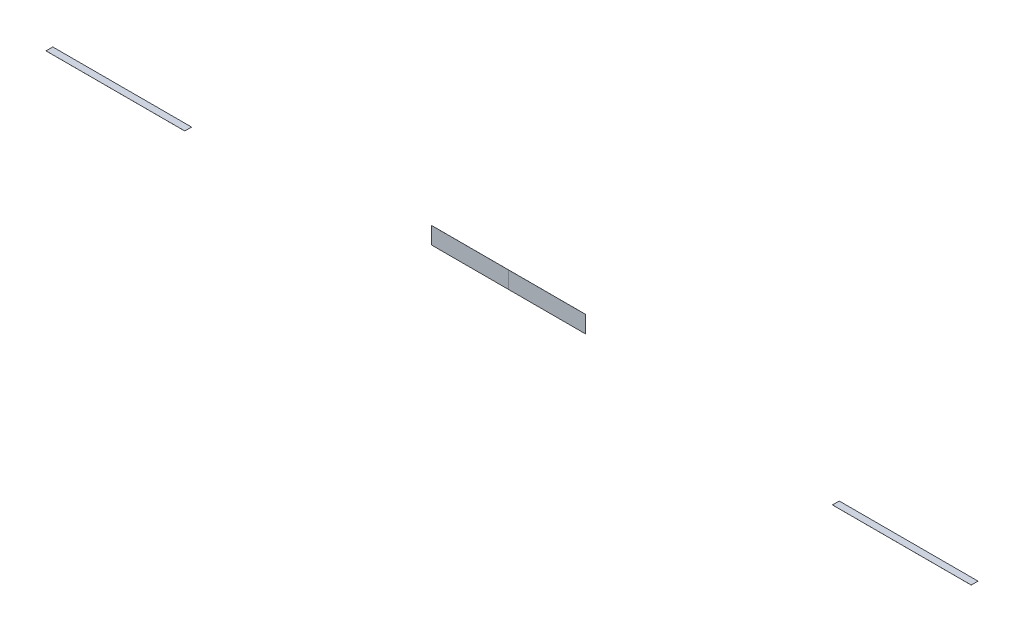
ISO-10303-21;
HEADER;
FILE_DESCRIPTION(('STEP AP214'),'2;1');
FILE_NAME('part.step','',(''),(''),'','','');
FILE_SCHEMA(('AUTOMOTIVE_DESIGN { 1 0 10303 214 1 1 1 1 }'));
ENDSEC;
DATA;
#1=APPLICATION_CONTEXT('core data for automotive mechanical design processes');
#2=APPLICATION_PROTOCOL_DEFINITION('international standard','automotive_design',2000,#1);
#3=PRODUCT_CONTEXT('',#1,'mechanical');
#4=PRODUCT('Part','Part','',(#3));
#5=PRODUCT_RELATED_PRODUCT_CATEGORY('part','',(#4));
#6=PRODUCT_DEFINITION_FORMATION('','',#4);
#7=PRODUCT_DEFINITION_CONTEXT('part definition',#1,'design');
#8=PRODUCT_DEFINITION('design','',#6,#7);
#9=PRODUCT_DEFINITION_SHAPE('','',#8);
#10=(LENGTH_UNIT() NAMED_UNIT(*) SI_UNIT(.MILLI.,.METRE.));
#11=(NAMED_UNIT(*) PLANE_ANGLE_UNIT() SI_UNIT($,.RADIAN.));
#12=(NAMED_UNIT(*) SI_UNIT($,.STERADIAN.) SOLID_ANGLE_UNIT());
#13=UNCERTAINTY_MEASURE_WITH_UNIT(LENGTH_MEASURE(1.E-05),#10,'distance_accuracy_value','');
#14=(GEOMETRIC_REPRESENTATION_CONTEXT(3) GLOBAL_UNCERTAINTY_ASSIGNED_CONTEXT((#13)) GLOBAL_UNIT_ASSIGNED_CONTEXT((#10,
#11,#12)) REPRESENTATION_CONTEXT('',''));
#15=CARTESIAN_POINT('',(0.,0.,0.));
#16=DIRECTION('',(0.,0.,1.));
#17=DIRECTION('',(1.,0.,0.));
#18=AXIS2_PLACEMENT_3D('',#15,#16,#17);
#19=CARTESIAN_POINT('',(2550.,91.99,-22.0100000000007));
#20=DIRECTION('',(-1.,0.,0.));
#21=DIRECTION('',(0.,0.,1.));
#22=AXIS2_PLACEMENT_3D('',#19,#20,#21);
#23=PLANE('',#22);
#24=DIRECTION('',(0.,0.,1.));
#25=VECTOR('',#24,1.);
#26=CARTESIAN_POINT('',(2550.,92.1,-11.0000000000007));
#27=LINE('',#26,#25);
#28=CARTESIAN_POINT('',(2550.,92.1,-22.0000000000007));
#29=VERTEX_POINT('',#28);
#30=CARTESIAN_POINT('',(2550.,92.1,-7.37216624891097E-13));
#31=VERTEX_POINT('',#30);
#32=EDGE_CURVE('P0_E77',#29,#31,#27,.T.);
#33=ORIENTED_EDGE('',*,*,#32,.F.);
#34=DIRECTION('',(0.,-1.,0.));
#35=VECTOR('',#34,1.);
#36=CARTESIAN_POINT('',(2550.,92.05,-22.0000000000007));
#37=LINE('',#36,#35);
#38=CARTESIAN_POINT('',(2550.,92.,-22.0000000000007));
#39=VERTEX_POINT('',#38);
#40=EDGE_CURVE('P0_E21',#29,#39,#37,.T.);
#41=ORIENTED_EDGE('',*,*,#40,.T.);
#42=DIRECTION('',(0.,0.,-1.));
#43=VECTOR('',#42,1.);
#44=CARTESIAN_POINT('',(2550.,92.,-11.0000000000007));
#45=LINE('',#44,#43);
#46=CARTESIAN_POINT('',(2550.,92.,-7.37216624891097E-13));
#47=VERTEX_POINT('',#46);
#48=EDGE_CURVE('P0_E58',#47,#39,#45,.T.);
#49=ORIENTED_EDGE('',*,*,#48,.F.);
#50=DIRECTION('',(0.,-1.,0.));
#51=VECTOR('',#50,1.);
#52=CARTESIAN_POINT('',(2550.,92.05,-7.37188088351104E-13));
#53=LINE('',#52,#51);
#54=EDGE_CURVE('P0_E61',#31,#47,#53,.T.);
#55=ORIENTED_EDGE('',*,*,#54,.F.);
#56=EDGE_LOOP('',(#33,#41,#49,#55));
#57=FACE_BOUND('',#56,.T.);
#58=ADVANCED_FACE('P0_F17',(#57),#23,.T.);
#59=CARTESIAN_POINT('',(2549.99,91.99,-7.37188088351104E-13));
#60=DIRECTION('',(0.,0.,1.));
#61=DIRECTION('',(1.,0.,0.));
#62=AXIS2_PLACEMENT_3D('',#59,#60,#61);
#63=PLANE('',#62);
#64=DIRECTION('',(1.,0.,0.));
#65=VECTOR('',#64,1.);
#66=CARTESIAN_POINT('',(2775.,92.1,-7.37194796852046E-13));
#67=LINE('',#66,#65);
#68=CARTESIAN_POINT('',(3000.,92.1,-7.37206477436389E-13));
#69=VERTEX_POINT('',#68);
#70=EDGE_CURVE('P0_E74',#31,#69,#67,.T.);
#71=ORIENTED_EDGE('',*,*,#70,.F.);
#72=ORIENTED_EDGE('',*,*,#54,.T.);
#73=DIRECTION('',(-1.,0.,0.));
#74=VECTOR('',#73,1.);
#75=CARTESIAN_POINT('',(2775.,92.,-7.37194796852046E-13));
#76=LINE('',#75,#74);
#77=CARTESIAN_POINT('',(3000.,92.,-7.37215354341676E-13));
#78=VERTEX_POINT('',#77);
#79=EDGE_CURVE('P0_E71',#78,#47,#76,.T.);
#80=ORIENTED_EDGE('',*,*,#79,.F.);
#81=DIRECTION('',(0.,-1.,0.));
#82=VECTOR('',#81,1.);
#83=CARTESIAN_POINT('',(3000.,92.05,-7.37189714654363E-13));
#84=LINE('',#83,#82);
#85=EDGE_CURVE('P0_E53',#69,#78,#84,.T.);
#86=ORIENTED_EDGE('',*,*,#85,.F.);
#87=EDGE_LOOP('',(#71,#72,#80,#86));
#88=FACE_BOUND('',#87,.T.);
#89=ADVANCED_FACE('P0_F70',(#88),#63,.T.);
#90=CARTESIAN_POINT('',(3000.,91.99,0.00999999999926281));
#91=DIRECTION('',(1.,0.,0.));
#92=DIRECTION('',(0.,0.,-1.));
#93=AXIS2_PLACEMENT_3D('',#90,#91,#92);
#94=PLANE('',#93);
#95=DIRECTION('',(0.,0.,-1.));
#96=VECTOR('',#95,1.);
#97=CARTESIAN_POINT('',(3000.,92.1,-11.0000000000007));
#98=LINE('',#97,#96);
#99=CARTESIAN_POINT('',(3000.,92.1,-22.0000000000007));
#100=VERTEX_POINT('',#99);
#101=EDGE_CURVE('P0_E85',#69,#100,#98,.T.);
#102=ORIENTED_EDGE('',*,*,#101,.F.);
#103=ORIENTED_EDGE('',*,*,#85,.T.);
#104=DIRECTION('',(0.,0.,1.));
#105=VECTOR('',#104,1.);
#106=CARTESIAN_POINT('',(3000.,92.,-11.0000000000007));
#107=LINE('',#106,#105);
#108=CARTESIAN_POINT('',(3000.,92.,-22.0000000000007));
#109=VERTEX_POINT('',#108);
#110=EDGE_CURVE('P0_E67',#109,#78,#107,.T.);
#111=ORIENTED_EDGE('',*,*,#110,.F.);
#112=DIRECTION('',(0.,1.,0.));
#113=VECTOR('',#112,1.);
#114=CARTESIAN_POINT('',(3000.,92.05,-22.0000000000007));
#115=LINE('',#114,#113);
#116=EDGE_CURVE('P0_E36',#109,#100,#115,.T.);
#117=ORIENTED_EDGE('',*,*,#116,.T.);
#118=EDGE_LOOP('',(#102,#103,#111,#117));
#119=FACE_BOUND('',#118,.T.);
#120=ADVANCED_FACE('P0_F89',(#119),#94,.T.);
#121=CARTESIAN_POINT('',(2549.99,92.,-22.0100000000007));
#122=DIRECTION('',(0.,-1.,0.));
#123=DIRECTION('',(1.,0.,0.));
#124=AXIS2_PLACEMENT_3D('',#121,#122,#123);
#125=PLANE('',#124);
#126=ORIENTED_EDGE('',*,*,#110,.T.);
#127=ORIENTED_EDGE('',*,*,#79,.T.);
#128=ORIENTED_EDGE('',*,*,#48,.T.);
#129=DIRECTION('',(-1.,0.,0.));
#130=VECTOR('',#129,1.);
#131=CARTESIAN_POINT('',(2775.,92.,-22.0000000000007));
#132=LINE('',#131,#130);
#133=EDGE_CURVE('P0_E27',#109,#39,#132,.T.);
#134=ORIENTED_EDGE('',*,*,#133,.F.);
#135=EDGE_LOOP('',(#126,#127,#128,#134));
#136=FACE_BOUND('',#135,.T.);
#137=ADVANCED_FACE('P0_F76',(#136),#125,.T.);
#138=CARTESIAN_POINT('',(2549.99,92.1,-22.0100000000007));
#139=DIRECTION('',(0.,1.,0.));
#140=DIRECTION('',(0.,0.,1.));
#141=AXIS2_PLACEMENT_3D('',#138,#139,#140);
#142=PLANE('',#141);
#143=ORIENTED_EDGE('',*,*,#101,.T.);
#144=DIRECTION('',(1.,0.,0.));
#145=VECTOR('',#144,1.);
#146=CARTESIAN_POINT('',(2775.,92.1,-22.0000000000007));
#147=LINE('',#146,#145);
#148=EDGE_CURVE('P0_E11',#29,#100,#147,.T.);
#149=ORIENTED_EDGE('',*,*,#148,.F.);
#150=ORIENTED_EDGE('',*,*,#32,.T.);
#151=ORIENTED_EDGE('',*,*,#70,.T.);
#152=EDGE_LOOP('',(#143,#149,#150,#151));
#153=FACE_BOUND('',#152,.T.);
#154=ADVANCED_FACE('P0_F97',(#153),#142,.T.);
#155=CARTESIAN_POINT('',(3000.01,91.99,-22.0000000000007));
#156=DIRECTION('',(0.,0.,-1.));
#157=DIRECTION('',(-1.,0.,0.));
#158=AXIS2_PLACEMENT_3D('',#155,#156,#157);
#159=PLANE('',#158);
#160=ORIENTED_EDGE('',*,*,#148,.T.);
#161=ORIENTED_EDGE('',*,*,#116,.F.);
#162=ORIENTED_EDGE('',*,*,#133,.T.);
#163=ORIENTED_EDGE('',*,*,#40,.F.);
#164=EDGE_LOOP('',(#160,#161,#162,#163));
#165=FACE_BOUND('',#164,.T.);
#166=ADVANCED_FACE('P0_F19',(#165),#159,.T.);
#167=CLOSED_SHELL('',(#58,#89,#120,#137,#154,#166));
#168=MANIFOLD_SOLID_BREP('P0_B1',#167);
#169=CARTESIAN_POINT('',(5.6843418860808E-13,91.99,-22.0100000000007));
#170=DIRECTION('',(-1.,0.,0.));
#171=DIRECTION('',(0.,0.,1.));
#172=AXIS2_PLACEMENT_3D('',#169,#170,#171);
#173=PLANE('',#172);
#174=DIRECTION('',(0.,0.,1.));
#175=VECTOR('',#174,1.);
#176=CARTESIAN_POINT('',(5.68437034638783E-13,92.1,-11.0000000000007));
#177=LINE('',#176,#175);
#178=CARTESIAN_POINT('',(5.70054503343871E-13,92.1,-22.0000000000007));
#179=VERTEX_POINT('',#178);
#180=CARTESIAN_POINT('',(5.65103807525407E-13,92.1,-7.369997844566E-13));
#181=VERTEX_POINT('',#180);
#182=EDGE_CURVE('P1_E77',#179,#181,#177,.T.);
#183=ORIENTED_EDGE('',*,*,#182,.F.);
#184=DIRECTION('',(0.,-1.,0.));
#185=VECTOR('',#184,1.);
#186=CARTESIAN_POINT('',(5.6843418860808E-13,92.05,-22.0000000000007));
#187=LINE('',#186,#185);
#188=CARTESIAN_POINT('',(5.81432586429236E-13,92.,-22.0000000000007));
#189=VERTEX_POINT('',#188);
#190=EDGE_CURVE('P1_E21',#179,#189,#187,.T.);
#191=ORIENTED_EDGE('',*,*,#190,.T.);
#192=DIRECTION('',(0.,0.,-1.));
#193=VECTOR('',#192,1.);
#194=CARTESIAN_POINT('',(5.86206938839231E-13,92.,-11.0000000000007));
#195=LINE('',#194,#193);
#196=CARTESIAN_POINT('',(5.65107094394061E-13,92.,-7.369997844566E-13));
#197=VERTEX_POINT('',#196);
#198=EDGE_CURVE('P1_E58',#197,#189,#195,.T.);
#199=ORIENTED_EDGE('',*,*,#198,.F.);
#200=DIRECTION('',(0.,-1.,0.));
#201=VECTOR('',#200,1.);
#202=CARTESIAN_POINT('',(5.68433646506994E-13,92.05,-7.37188088351104E-13));
#203=LINE('',#202,#201);
#204=EDGE_CURVE('P1_E61',#181,#197,#203,.T.);
#205=ORIENTED_EDGE('',*,*,#204,.F.);
#206=EDGE_LOOP('',(#183,#191,#199,#205));
#207=FACE_BOUND('',#206,.T.);
#208=ADVANCED_FACE('P1_F17',(#207),#173,.T.);
#209=CARTESIAN_POINT('',(-0.00999999999943157,91.99,-7.37188088351104E-13));
#210=DIRECTION('',(0.,0.,1.));
#211=DIRECTION('',(1.,0.,0.));
#212=AXIS2_PLACEMENT_3D('',#209,#210,#211);
#213=PLANE('',#212);
#214=DIRECTION('',(1.,0.,0.));
#215=VECTOR('',#214,1.);
#216=CARTESIAN_POINT('',(225.000000000001,92.1,-7.37194796852046E-13));
#217=LINE('',#216,#215);
#218=CARTESIAN_POINT('',(450.000000000001,92.1,-7.37206477436389E-13));
#219=VERTEX_POINT('',#218);
#220=EDGE_CURVE('P1_E74',#181,#219,#217,.T.);
#221=ORIENTED_EDGE('',*,*,#220,.F.);
#222=ORIENTED_EDGE('',*,*,#204,.T.);
#223=DIRECTION('',(-1.,0.,0.));
#224=VECTOR('',#223,1.);
#225=CARTESIAN_POINT('',(225.000000000001,92.,-7.37194796852046E-13));
#226=LINE('',#225,#224);
#227=CARTESIAN_POINT('',(450.000000000001,92.,-7.36998513907179E-13));
#228=VERTEX_POINT('',#227);
#229=EDGE_CURVE('P1_E71',#228,#197,#226,.T.);
#230=ORIENTED_EDGE('',*,*,#229,.F.);
#231=DIRECTION('',(0.,-1.,0.));
#232=VECTOR('',#231,1.);
#233=CARTESIAN_POINT('',(450.000000000001,92.05,-7.37189714654363E-13));
#234=LINE('',#233,#232);
#235=EDGE_CURVE('P1_E53',#219,#228,#234,.T.);
#236=ORIENTED_EDGE('',*,*,#235,.F.);
#237=EDGE_LOOP('',(#221,#222,#230,#236));
#238=FACE_BOUND('',#237,.T.);
#239=ADVANCED_FACE('P1_F70',(#238),#213,.T.);
#240=CARTESIAN_POINT('',(450.000000000001,91.99,0.00999999999926281));
#241=DIRECTION('',(1.,0.,0.));
#242=DIRECTION('',(0.,0.,-1.));
#243=AXIS2_PLACEMENT_3D('',#240,#241,#242);
#244=PLANE('',#243);
#245=DIRECTION('',(0.,0.,-1.));
#246=VECTOR('',#245,1.);
#247=CARTESIAN_POINT('',(450.000000000001,92.1,-11.0000000000007));
#248=LINE('',#247,#246);
#249=CARTESIAN_POINT('',(450.000000000001,92.1,-22.0000000000007));
#250=VERTEX_POINT('',#249);
#251=EDGE_CURVE('P1_E85',#219,#250,#248,.T.);
#252=ORIENTED_EDGE('',*,*,#251,.F.);
#253=ORIENTED_EDGE('',*,*,#235,.T.);
#254=DIRECTION('',(0.,0.,1.));
#255=VECTOR('',#254,1.);
#256=CARTESIAN_POINT('',(450.000000000001,92.,-11.0000000000007));
#257=LINE('',#256,#255);
#258=CARTESIAN_POINT('',(450.000000000001,92.,-22.0000000000007));
#259=VERTEX_POINT('',#258);
#260=EDGE_CURVE('P1_E67',#259,#228,#257,.T.);
#261=ORIENTED_EDGE('',*,*,#260,.F.);
#262=DIRECTION('',(0.,1.,0.));
#263=VECTOR('',#262,1.);
#264=CARTESIAN_POINT('',(450.000000000001,92.05,-22.0000000000007));
#265=LINE('',#264,#263);
#266=EDGE_CURVE('P1_E36',#259,#250,#265,.T.);
#267=ORIENTED_EDGE('',*,*,#266,.T.);
#268=EDGE_LOOP('',(#252,#253,#261,#267));
#269=FACE_BOUND('',#268,.T.);
#270=ADVANCED_FACE('P1_F89',(#269),#244,.T.);
#271=CARTESIAN_POINT('',(-0.00999999999944379,92.,-22.0100000000007));
#272=DIRECTION('',(0.,-1.,0.));
#273=DIRECTION('',(1.,0.,0.));
#274=AXIS2_PLACEMENT_3D('',#271,#272,#273);
#275=PLANE('',#274);
#276=ORIENTED_EDGE('',*,*,#260,.T.);
#277=ORIENTED_EDGE('',*,*,#229,.T.);
#278=ORIENTED_EDGE('',*,*,#198,.T.);
#279=DIRECTION('',(-1.,0.,0.));
#280=VECTOR('',#279,1.);
#281=CARTESIAN_POINT('',(225.000000000001,92.,-22.0000000000007));
#282=LINE('',#281,#280);
#283=EDGE_CURVE('P1_E27',#259,#189,#282,.T.);
#284=ORIENTED_EDGE('',*,*,#283,.F.);
#285=EDGE_LOOP('',(#276,#277,#278,#284));
#286=FACE_BOUND('',#285,.T.);
#287=ADVANCED_FACE('P1_F76',(#286),#275,.T.);
#288=CARTESIAN_POINT('',(-0.00999999999944379,92.1,-22.0100000000007));
#289=DIRECTION('',(0.,1.,0.));
#290=DIRECTION('',(0.,0.,1.));
#291=AXIS2_PLACEMENT_3D('',#288,#289,#290);
#292=PLANE('',#291);
#293=ORIENTED_EDGE('',*,*,#251,.T.);
#294=DIRECTION('',(1.,0.,0.));
#295=VECTOR('',#294,1.);
#296=CARTESIAN_POINT('',(225.000000000001,92.1,-22.0000000000007));
#297=LINE('',#296,#295);
#298=EDGE_CURVE('P1_E11',#179,#250,#297,.T.);
#299=ORIENTED_EDGE('',*,*,#298,.F.);
#300=ORIENTED_EDGE('',*,*,#182,.T.);
#301=ORIENTED_EDGE('',*,*,#220,.T.);
#302=EDGE_LOOP('',(#293,#299,#300,#301));
#303=FACE_BOUND('',#302,.T.);
#304=ADVANCED_FACE('P1_F97',(#303),#292,.T.);
#305=CARTESIAN_POINT('',(450.010000000001,91.99,-22.0000000000007));
#306=DIRECTION('',(0.,0.,-1.));
#307=DIRECTION('',(-1.,0.,0.));
#308=AXIS2_PLACEMENT_3D('',#305,#306,#307);
#309=PLANE('',#308);
#310=ORIENTED_EDGE('',*,*,#298,.T.);
#311=ORIENTED_EDGE('',*,*,#266,.F.);
#312=ORIENTED_EDGE('',*,*,#283,.T.);
#313=ORIENTED_EDGE('',*,*,#190,.F.);
#314=EDGE_LOOP('',(#310,#311,#312,#313));
#315=FACE_BOUND('',#314,.T.);
#316=ADVANCED_FACE('P1_F19',(#315),#309,.T.);
#317=CLOSED_SHELL('',(#208,#239,#270,#287,#304,#316));
#318=MANIFOLD_SOLID_BREP('P1_B1',#317);
#319=CARTESIAN_POINT('',(1499.99999999993,171.99,-0.00999999997207311));
#320=DIRECTION('',(1.,0.,0.));
#321=DIRECTION('',(0.,1.,0.));
#322=AXIS2_PLACEMENT_3D('',#319,#320,#321);
#323=PLANE('',#322);
#324=DIRECTION('',(0.,1.,0.));
#325=VECTOR('',#324,1.);
#326=CARTESIAN_POINT('',(1499.99999999993,199.5,0.100000000027927));
#327=LINE('',#326,#325);
#328=CARTESIAN_POINT('',(1499.99999999993,172.,0.100000000027927));
#329=VERTEX_POINT('',#328);
#330=CARTESIAN_POINT('',(1499.99999999993,227.,0.100000000027927));
#331=VERTEX_POINT('',#330);
#332=EDGE_CURVE('P2_E77',#329,#331,#327,.T.);
#333=ORIENTED_EDGE('',*,*,#332,.F.);
#334=DIRECTION('',(0.,0.,-1.));
#335=VECTOR('',#334,1.);
#336=CARTESIAN_POINT('',(1499.99999999993,172.,0.0500000000279269));
#337=LINE('',#336,#335);
#338=CARTESIAN_POINT('',(1499.99999999993,172.,2.79268883751029E-11));
#339=VERTEX_POINT('',#338);
#340=EDGE_CURVE('P2_E21',#329,#339,#337,.T.);
#341=ORIENTED_EDGE('',*,*,#340,.T.);
#342=DIRECTION('',(0.,-1.,0.));
#343=VECTOR('',#342,1.);
#344=CARTESIAN_POINT('',(1499.99999999993,199.5,2.79268969061164E-11));
#345=LINE('',#344,#343);
#346=CARTESIAN_POINT('',(1499.99999999993,227.,2.79269002335641E-11));
#347=VERTEX_POINT('',#346);
#348=EDGE_CURVE('P2_E58',#347,#339,#345,.T.);
#349=ORIENTED_EDGE('',*,*,#348,.F.);
#350=DIRECTION('',(0.,0.,-1.));
#351=VECTOR('',#350,1.);
#352=CARTESIAN_POINT('',(1499.99999999993,227.,0.0500000000279267));
#353=LINE('',#352,#351);
#354=EDGE_CURVE('P2_E61',#331,#347,#353,.T.);
#355=ORIENTED_EDGE('',*,*,#354,.F.);
#356=EDGE_LOOP('',(#333,#341,#349,#355));
#357=FACE_BOUND('',#356,.T.);
#358=ADVANCED_FACE('P2_F17',(#357),#323,.T.);
#359=CARTESIAN_POINT('',(1500.00999999993,227.,-0.00999999997207357));
#360=DIRECTION('',(0.,1.,0.));
#361=DIRECTION('',(-1.,0.,0.));
#362=AXIS2_PLACEMENT_3D('',#359,#360,#361);
#363=PLANE('',#362);
#364=DIRECTION('',(-1.,0.,0.));
#365=VECTOR('',#364,1.);
#366=CARTESIAN_POINT('',(1374.99999999993,227.,0.100000000027927));
#367=LINE('',#366,#365);
#368=CARTESIAN_POINT('',(1249.99999999993,227.,0.100000000036698));
#369=VERTEX_POINT('',#368);
#370=EDGE_CURVE('P2_E74',#331,#369,#367,.T.);
#371=ORIENTED_EDGE('',*,*,#370,.F.);
#372=ORIENTED_EDGE('',*,*,#354,.T.);
#373=DIRECTION('',(1.,0.,0.));
#374=VECTOR('',#373,1.);
#375=CARTESIAN_POINT('',(1374.99999999993,227.,3.37746497436342E-11));
#376=LINE('',#375,#374);
#377=CARTESIAN_POINT('',(1249.99999999993,227.,3.96224121963677E-11));
#378=VERTEX_POINT('',#377);
#379=EDGE_CURVE('P2_E71',#378,#347,#376,.T.);
#380=ORIENTED_EDGE('',*,*,#379,.F.);
#381=DIRECTION('',(0.,0.,-1.));
#382=VECTOR('',#381,1.);
#383=CARTESIAN_POINT('',(1249.99999999993,227.,0.0500000000396222));
#384=LINE('',#383,#382);
#385=EDGE_CURVE('P2_E53',#369,#378,#384,.T.);
#386=ORIENTED_EDGE('',*,*,#385,.F.);
#387=EDGE_LOOP('',(#371,#372,#380,#386));
#388=FACE_BOUND('',#387,.T.);
#389=ADVANCED_FACE('P2_F70',(#388),#363,.T.);
#390=CARTESIAN_POINT('',(1249.99999999993,227.01,-0.0099999999603776));
#391=DIRECTION('',(-1.,0.,0.));
#392=DIRECTION('',(0.,-1.,0.));
#393=AXIS2_PLACEMENT_3D('',#390,#391,#392);
#394=PLANE('',#393);
#395=DIRECTION('',(0.,-1.,0.));
#396=VECTOR('',#395,1.);
#397=CARTESIAN_POINT('',(1249.99999999993,199.5,0.100000000027927));
#398=LINE('',#397,#396);
#399=CARTESIAN_POINT('',(1249.99999999993,172.,0.100000000036698));
#400=VERTEX_POINT('',#399);
#401=EDGE_CURVE('P2_E85',#369,#400,#398,.T.);
#402=ORIENTED_EDGE('',*,*,#401,.F.);
#403=ORIENTED_EDGE('',*,*,#385,.T.);
#404=DIRECTION('',(0.,1.,0.));
#405=VECTOR('',#404,1.);
#406=CARTESIAN_POINT('',(1249.99999999993,199.5,3.9622402581152E-11));
#407=LINE('',#406,#405);
#408=CARTESIAN_POINT('',(1249.99999999993,172.,3.96224003379064E-11));
#409=VERTEX_POINT('',#408);
#410=EDGE_CURVE('P2_E67',#409,#378,#407,.T.);
#411=ORIENTED_EDGE('',*,*,#410,.F.);
#412=DIRECTION('',(0.,0.,1.));
#413=VECTOR('',#412,1.);
#414=CARTESIAN_POINT('',(1249.99999999993,172.,0.0500000000396222));
#415=LINE('',#414,#413);
#416=EDGE_CURVE('P2_E36',#409,#400,#415,.T.);
#417=ORIENTED_EDGE('',*,*,#416,.T.);
#418=EDGE_LOOP('',(#402,#403,#411,#417));
#419=FACE_BOUND('',#418,.T.);
#420=ADVANCED_FACE('P2_F89',(#419),#394,.T.);
#421=CARTESIAN_POINT('',(1500.00999999993,171.99,2.79264290858894E-11));
#422=DIRECTION('',(0.,0.,-1.));
#423=DIRECTION('',(-1.,0.,0.));
#424=AXIS2_PLACEMENT_3D('',#421,#422,#423);
#425=PLANE('',#424);
#426=ORIENTED_EDGE('',*,*,#410,.T.);
#427=ORIENTED_EDGE('',*,*,#379,.T.);
#428=ORIENTED_EDGE('',*,*,#348,.T.);
#429=DIRECTION('',(1.,0.,0.));
#430=VECTOR('',#429,1.);
#431=CARTESIAN_POINT('',(1374.99999999993,172.,3.377462392607E-11));
#432=LINE('',#431,#430);
#433=EDGE_CURVE('P2_E27',#409,#339,#432,.T.);
#434=ORIENTED_EDGE('',*,*,#433,.F.);
#435=EDGE_LOOP('',(#426,#427,#428,#434));
#436=FACE_BOUND('',#435,.T.);
#437=ADVANCED_FACE('P2_F76',(#436),#425,.T.);
#438=CARTESIAN_POINT('',(1249.98999999993,171.99,0.100000000027927));
#439=DIRECTION('',(0.,0.,1.));
#440=DIRECTION('',(1.,0.,0.));
#441=AXIS2_PLACEMENT_3D('',#438,#439,#440);
#442=PLANE('',#441);
#443=ORIENTED_EDGE('',*,*,#401,.T.);
#444=DIRECTION('',(-1.,0.,0.));
#445=VECTOR('',#444,1.);
#446=CARTESIAN_POINT('',(1374.99999999993,172.,0.100000000033775));
#447=LINE('',#446,#445);
#448=EDGE_CURVE('P2_E11',#329,#400,#447,.T.);
#449=ORIENTED_EDGE('',*,*,#448,.F.);
#450=ORIENTED_EDGE('',*,*,#332,.T.);
#451=ORIENTED_EDGE('',*,*,#370,.T.);
#452=EDGE_LOOP('',(#443,#449,#450,#451));
#453=FACE_BOUND('',#452,.T.);
#454=ADVANCED_FACE('P2_F97',(#453),#442,.T.);
#455=CARTESIAN_POINT('',(1249.98999999993,172.,-0.00999999996037713));
#456=DIRECTION('',(0.,-1.,0.));
#457=DIRECTION('',(1.,0.,0.));
#458=AXIS2_PLACEMENT_3D('',#455,#456,#457);
#459=PLANE('',#458);
#460=ORIENTED_EDGE('',*,*,#448,.T.);
#461=ORIENTED_EDGE('',*,*,#416,.F.);
#462=ORIENTED_EDGE('',*,*,#433,.T.);
#463=ORIENTED_EDGE('',*,*,#340,.F.);
#464=EDGE_LOOP('',(#460,#461,#462,#463));
#465=FACE_BOUND('',#464,.T.);
#466=ADVANCED_FACE('P2_F19',(#465),#459,.T.);
#467=CLOSED_SHELL('',(#358,#389,#420,#437,#454,#466));
#468=MANIFOLD_SOLID_BREP('P2_B1',#467);
#469=CARTESIAN_POINT('',(1499.98999999993,172.,-0.00999999997207263));
#470=DIRECTION('',(0.,-1.,0.));
#471=DIRECTION('',(1.,0.,0.));
#472=AXIS2_PLACEMENT_3D('',#469,#470,#471);
#473=PLANE('',#472);
#474=DIRECTION('',(1.,0.,0.));
#475=VECTOR('',#474,1.);
#476=CARTESIAN_POINT('',(1625.,172.,0.100000000016231));
#477=LINE('',#476,#475);
#478=CARTESIAN_POINT('',(1499.99999999993,172.,0.100000000025003));
#479=VERTEX_POINT('',#478);
#480=CARTESIAN_POINT('',(1750.00000000007,172.,0.100000000016231));
#481=VERTEX_POINT('',#480);
#482=EDGE_CURVE('P3_E77',#479,#481,#477,.T.);
#483=ORIENTED_EDGE('',*,*,#482,.F.);
#484=DIRECTION('',(0.,0.,-1.));
#485=VECTOR('',#484,1.);
#486=CARTESIAN_POINT('',(1499.99999999993,172.,0.0500000000279267));
#487=LINE('',#486,#485);
#488=CARTESIAN_POINT('',(1499.99999999993,172.,2.79268978075509E-11));
#489=VERTEX_POINT('',#488);
#490=EDGE_CURVE('P3_E21',#479,#489,#487,.T.);
#491=ORIENTED_EDGE('',*,*,#490,.T.);
#492=DIRECTION('',(-1.,0.,0.));
#493=VECTOR('',#492,1.);
#494=CARTESIAN_POINT('',(1625.,172.,2.20791440685953E-11));
#495=LINE('',#494,#493);
#496=CARTESIAN_POINT('',(1750.00000000007,172.,1.62314072957145E-11));
#497=VERTEX_POINT('',#496);
#498=EDGE_CURVE('P3_E58',#497,#489,#495,.T.);
#499=ORIENTED_EDGE('',*,*,#498,.F.);
#500=DIRECTION('',(0.,0.,-1.));
#501=VECTOR('',#500,1.);
#502=CARTESIAN_POINT('',(1750.00000000007,172.,0.0500000000162312));
#503=LINE('',#502,#501);
#504=EDGE_CURVE('P3_E61',#481,#497,#503,.T.);
#505=ORIENTED_EDGE('',*,*,#504,.F.);
#506=EDGE_LOOP('',(#483,#491,#499,#505));
#507=FACE_BOUND('',#506,.T.);
#508=ADVANCED_FACE('P3_F17',(#507),#473,.T.);
#509=CARTESIAN_POINT('',(1750.00000000007,171.99,-0.00999999998376862));
#510=DIRECTION('',(1.,0.,0.));
#511=DIRECTION('',(0.,1.,0.));
#512=AXIS2_PLACEMENT_3D('',#509,#510,#511);
#513=PLANE('',#512);
#514=DIRECTION('',(0.,1.,0.));
#515=VECTOR('',#514,1.);
#516=CARTESIAN_POINT('',(1750.00000000007,199.5,0.100000000016231));
#517=LINE('',#516,#515);
#518=CARTESIAN_POINT('',(1750.00000000007,227.,0.100000000016231));
#519=VERTEX_POINT('',#518);
#520=EDGE_CURVE('P3_E74',#481,#519,#517,.T.);
#521=ORIENTED_EDGE('',*,*,#520,.F.);
#522=ORIENTED_EDGE('',*,*,#504,.T.);
#523=DIRECTION('',(0.,-1.,0.));
#524=VECTOR('',#523,1.);
#525=CARTESIAN_POINT('',(1750.00000000007,199.5,1.62313912310742E-11));
#526=LINE('',#525,#524);
#527=CARTESIAN_POINT('',(1750.00000000007,227.,1.62313937431873E-11));
#528=VERTEX_POINT('',#527);
#529=EDGE_CURVE('P3_E71',#528,#497,#526,.T.);
#530=ORIENTED_EDGE('',*,*,#529,.F.);
#531=DIRECTION('',(0.,0.,-1.));
#532=VECTOR('',#531,1.);
#533=CARTESIAN_POINT('',(1750.00000000007,227.,0.0500000000162314));
#534=LINE('',#533,#532);
#535=EDGE_CURVE('P3_E53',#519,#528,#534,.T.);
#536=ORIENTED_EDGE('',*,*,#535,.F.);
#537=EDGE_LOOP('',(#521,#522,#530,#536));
#538=FACE_BOUND('',#537,.T.);
#539=ADVANCED_FACE('P3_F70',(#538),#513,.T.);
#540=CARTESIAN_POINT('',(1750.01000000007,227.,-0.00999999998376908));
#541=DIRECTION('',(0.,1.,0.));
#542=DIRECTION('',(-1.,0.,0.));
#543=AXIS2_PLACEMENT_3D('',#540,#541,#542);
#544=PLANE('',#543);
#545=DIRECTION('',(-1.,0.,0.));
#546=VECTOR('',#545,1.);
#547=CARTESIAN_POINT('',(1625.,227.,0.100000000016231));
#548=LINE('',#547,#546);
#549=CARTESIAN_POINT('',(1499.99999999993,227.,0.100000000025003));
#550=VERTEX_POINT('',#549);
#551=EDGE_CURVE('P3_E85',#519,#550,#548,.T.);
#552=ORIENTED_EDGE('',*,*,#551,.F.);
#553=ORIENTED_EDGE('',*,*,#535,.T.);
#554=DIRECTION('',(1.,0.,0.));
#555=VECTOR('',#554,1.);
#556=CARTESIAN_POINT('',(1625.,227.,2.20791440685953E-11));
#557=LINE('',#556,#555);
#558=CARTESIAN_POINT('',(1499.99999999993,227.,2.7926880866892E-11));
#559=VERTEX_POINT('',#558);
#560=EDGE_CURVE('P3_E67',#559,#528,#557,.T.);
#561=ORIENTED_EDGE('',*,*,#560,.F.);
#562=DIRECTION('',(0.,0.,1.));
#563=VECTOR('',#562,1.);
#564=CARTESIAN_POINT('',(1499.99999999993,227.,0.0500000000279267));
#565=LINE('',#564,#563);
#566=EDGE_CURVE('P3_E36',#559,#550,#565,.T.);
#567=ORIENTED_EDGE('',*,*,#566,.T.);
#568=EDGE_LOOP('',(#552,#553,#561,#567));
#569=FACE_BOUND('',#568,.T.);
#570=ADVANCED_FACE('P3_F89',(#569),#544,.T.);
#571=CARTESIAN_POINT('',(1750.01000000007,171.99,1.62309234108472E-11));
#572=DIRECTION('',(0.,0.,-1.));
#573=DIRECTION('',(-1.,0.,0.));
#574=AXIS2_PLACEMENT_3D('',#571,#572,#573);
#575=PLANE('',#574);
#576=ORIENTED_EDGE('',*,*,#560,.T.);
#577=ORIENTED_EDGE('',*,*,#529,.T.);
#578=ORIENTED_EDGE('',*,*,#498,.T.);
#579=DIRECTION('',(0.,-1.,0.));
#580=VECTOR('',#579,1.);
#581=CARTESIAN_POINT('',(1499.99999999993,199.5,2.79268964995406E-11));
#582=LINE('',#581,#580);
#583=EDGE_CURVE('P3_E27',#559,#489,#582,.T.);
#584=ORIENTED_EDGE('',*,*,#583,.F.);
#585=EDGE_LOOP('',(#576,#577,#578,#584));
#586=FACE_BOUND('',#585,.T.);
#587=ADVANCED_FACE('P3_F76',(#586),#575,.T.);
#588=CARTESIAN_POINT('',(1499.98999999993,171.99,0.100000000016231));
#589=DIRECTION('',(0.,0.,1.));
#590=DIRECTION('',(1.,0.,0.));
#591=AXIS2_PLACEMENT_3D('',#588,#589,#590);
#592=PLANE('',#591);
#593=ORIENTED_EDGE('',*,*,#551,.T.);
#594=DIRECTION('',(0.,1.,0.));
#595=VECTOR('',#594,1.);
#596=CARTESIAN_POINT('',(1499.99999999993,199.5,0.100000000027927));
#597=LINE('',#596,#595);
#598=EDGE_CURVE('P3_E11',#479,#550,#597,.T.);
#599=ORIENTED_EDGE('',*,*,#598,.F.);
#600=ORIENTED_EDGE('',*,*,#482,.T.);
#601=ORIENTED_EDGE('',*,*,#520,.T.);
#602=EDGE_LOOP('',(#593,#599,#600,#601));
#603=FACE_BOUND('',#602,.T.);
#604=ADVANCED_FACE('P3_F97',(#603),#592,.T.);
#605=CARTESIAN_POINT('',(1499.99999999993,227.01,-0.00999999997207311));
#606=DIRECTION('',(-1.,0.,0.));
#607=DIRECTION('',(0.,-1.,0.));
#608=AXIS2_PLACEMENT_3D('',#605,#606,#607);
#609=PLANE('',#608);
#610=ORIENTED_EDGE('',*,*,#598,.T.);
#611=ORIENTED_EDGE('',*,*,#566,.F.);
#612=ORIENTED_EDGE('',*,*,#583,.T.);
#613=ORIENTED_EDGE('',*,*,#490,.F.);
#614=EDGE_LOOP('',(#610,#611,#612,#613));
#615=FACE_BOUND('',#614,.T.);
#616=ADVANCED_FACE('P3_F19',(#615),#609,.T.);
#617=CLOSED_SHELL('',(#508,#539,#570,#587,#604,#616));
#618=MANIFOLD_SOLID_BREP('P3_B1',#617);
#619=ADVANCED_BREP_SHAPE_REPRESENTATION('',(#18,#168,#318,#468,#618),#14);
#620=SHAPE_DEFINITION_REPRESENTATION(#9,#619);
ENDSEC;
END-ISO-10303-21;
